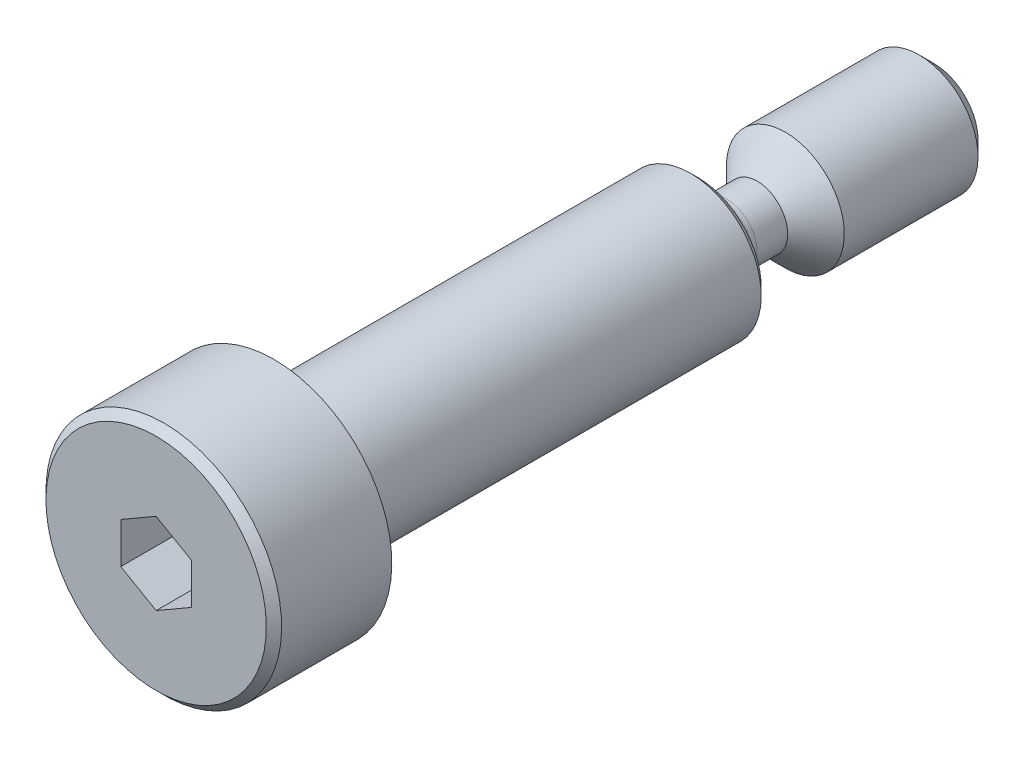
ISO-10303-21;
HEADER;
FILE_DESCRIPTION(('STEP AP214'),'2;1');
FILE_NAME('part.step','',(''),(''),'','','');
FILE_SCHEMA(('AUTOMOTIVE_DESIGN { 1 0 10303 214 1 1 1 1 }'));
ENDSEC;
DATA;
#1=APPLICATION_CONTEXT('core data for automotive mechanical design processes');
#2=APPLICATION_PROTOCOL_DEFINITION('international standard','automotive_design',2000,#1);
#3=PRODUCT_CONTEXT('',#1,'mechanical');
#4=PRODUCT('Part','Part','',(#3));
#5=PRODUCT_RELATED_PRODUCT_CATEGORY('part','',(#4));
#6=PRODUCT_DEFINITION_FORMATION('','',#4);
#7=PRODUCT_DEFINITION_CONTEXT('part definition',#1,'design');
#8=PRODUCT_DEFINITION('design','',#6,#7);
#9=PRODUCT_DEFINITION_SHAPE('','',#8);
#10=(LENGTH_UNIT() NAMED_UNIT(*) SI_UNIT(.MILLI.,.METRE.));
#11=(NAMED_UNIT(*) PLANE_ANGLE_UNIT() SI_UNIT($,.RADIAN.));
#12=(NAMED_UNIT(*) SI_UNIT($,.STERADIAN.) SOLID_ANGLE_UNIT());
#13=UNCERTAINTY_MEASURE_WITH_UNIT(LENGTH_MEASURE(1.E-05),#10,'distance_accuracy_value','');
#14=(GEOMETRIC_REPRESENTATION_CONTEXT(3) GLOBAL_UNCERTAINTY_ASSIGNED_CONTEXT((#13)) GLOBAL_UNIT_ASSIGNED_CONTEXT((#10,
#11,#12)) REPRESENTATION_CONTEXT('',''));
#15=CARTESIAN_POINT('',(0.,0.,0.));
#16=DIRECTION('',(0.,0.,1.));
#17=DIRECTION('',(1.,0.,0.));
#18=AXIS2_PLACEMENT_3D('',#15,#16,#17);
#19=CARTESIAN_POINT('',(0.,0.,-16.5));
#20=DIRECTION('',(0.,0.,-1.));
#21=DIRECTION('',(0.,1.,0.));
#22=AXIS2_PLACEMENT_3D('',#19,#20,#21);
#23=CYLINDRICAL_SURFACE('',#22,3.);
#24=CARTESIAN_POINT('',(0.,0.,-6.17499999999999));
#25=DIRECTION('',(0.,0.,-1.));
#26=DIRECTION('',(0.,1.,0.));
#27=AXIS2_PLACEMENT_3D('',#24,#25,#26);
#28=CIRCLE('',#27,3.);
#29=CARTESIAN_POINT('',(0.,3.,-6.17499999999999));
#30=VERTEX_POINT('',#29);
#31=EDGE_CURVE('E217',#30,#30,#28,.F.);
#32=ORIENTED_EDGE('',*,*,#31,.T.);
#33=EDGE_LOOP('',(#32));
#34=FACE_BOUND('',#33,.T.);
#35=CARTESIAN_POINT('',(0.,0.,10.6383333333333));
#36=DIRECTION('',(0.,0.,-1.));
#37=DIRECTION('',(0.,1.,0.));
#38=AXIS2_PLACEMENT_3D('',#35,#36,#37);
#39=CIRCLE('',#38,3.);
#40=CARTESIAN_POINT('',(0.,3.,10.6383333333333));
#41=VERTEX_POINT('',#40);
#42=EDGE_CURVE('E186',#41,#41,#39,.T.);
#43=ORIENTED_EDGE('',*,*,#42,.T.);
#44=EDGE_LOOP('',(#43));
#45=FACE_BOUND('',#44,.T.);
#46=ADVANCED_FACE('F41',(#34,#45),#23,.T.);
#47=CARTESIAN_POINT('',(0.,-3.,-6.5));
#48=DIRECTION('',(0.,0.,-1.));
#49=DIRECTION('',(0.,1.,0.));
#50=AXIS2_PLACEMENT_3D('',#47,#48,#49);
#51=PLANE('',#50);
#52=CARTESIAN_POINT('',(0.,0.,-6.5));
#53=DIRECTION('',(0.,0.,-1.));
#54=DIRECTION('',(0.,1.,0.));
#55=AXIS2_PLACEMENT_3D('',#52,#53,#54);
#56=CIRCLE('',#55,2.675);
#57=CARTESIAN_POINT('',(0.,2.67499999999999,-6.5));
#58=VERTEX_POINT('',#57);
#59=EDGE_CURVE('E213',#58,#58,#56,.T.);
#60=ORIENTED_EDGE('',*,*,#59,.T.);
#61=EDGE_LOOP('',(#60));
#62=FACE_BOUND('',#61,.T.);
#63=CARTESIAN_POINT('',(0.,0.,-6.5));
#64=DIRECTION('',(0.,0.,-1.));
#65=DIRECTION('',(0.,1.,0.));
#66=AXIS2_PLACEMENT_3D('',#63,#64,#65);
#67=CIRCLE('',#66,2.5);
#68=CARTESIAN_POINT('',(0.,2.5,-6.5));
#69=VERTEX_POINT('',#68);
#70=EDGE_CURVE('E173',#69,#69,#67,.T.);
#71=ORIENTED_EDGE('',*,*,#70,.F.);
#72=EDGE_LOOP('',(#71));
#73=FACE_BOUND('',#72,.T.);
#74=ADVANCED_FACE('F241',(#62,#73),#51,.T.);
#75=CARTESIAN_POINT('',(0.,0.,-16.5));
#76=DIRECTION('',(0.,0.,-1.));
#77=DIRECTION('',(0.,1.,0.));
#78=AXIS2_PLACEMENT_3D('',#75,#76,#77);
#79=CYLINDRICAL_SURFACE('',#78,2.33333333333333);
#80=CARTESIAN_POINT('',(0.,0.,11.0283333333333));
#81=DIRECTION('',(0.,0.,-1.));
#82=DIRECTION('',(0.,1.,0.));
#83=AXIS2_PLACEMENT_3D('',#80,#81,#82);
#84=CIRCLE('',#83,2.33333333333333);
#85=CARTESIAN_POINT('',(0.,2.33333333333333,11.0283333333333));
#86=VERTEX_POINT('',#85);
#87=EDGE_CURVE('E198',#86,#86,#84,.F.);
#88=ORIENTED_EDGE('',*,*,#87,.T.);
#89=EDGE_LOOP('',(#88));
#90=FACE_BOUND('',#89,.T.);
#91=CARTESIAN_POINT('',(0.,0.,11.5));
#92=DIRECTION('',(0.,0.,-1.));
#93=DIRECTION('',(0.,1.,0.));
#94=AXIS2_PLACEMENT_3D('',#91,#92,#93);
#95=CIRCLE('',#94,2.33333333333333);
#96=CARTESIAN_POINT('',(0.,2.33333333333333,11.5));
#97=VERTEX_POINT('',#96);
#98=EDGE_CURVE('E178',#97,#97,#95,.T.);
#99=ORIENTED_EDGE('',*,*,#98,.T.);
#100=EDGE_LOOP('',(#99));
#101=FACE_BOUND('',#100,.T.);
#102=ADVANCED_FACE('F247',(#90,#101),#79,.T.);
#103=CARTESIAN_POINT('',(0.,2.99999999999999,10.8333333333333));
#104=DIRECTION('',(0.,0.,-1.));
#105=DIRECTION('',(0.,1.,0.));
#106=AXIS2_PLACEMENT_3D('',#103,#104,#105);
#107=PLANE('',#106);
#108=CARTESIAN_POINT('',(0.,0.,10.8333333333333));
#109=DIRECTION('',(0.,0.,-1.));
#110=DIRECTION('',(0.,1.,0.));
#111=AXIS2_PLACEMENT_3D('',#108,#109,#110);
#112=CIRCLE('',#111,2.80499999999999);
#113=CARTESIAN_POINT('',(0.,2.80499999999998,10.8333333333333));
#114=VERTEX_POINT('',#113);
#115=EDGE_CURVE('E194',#114,#114,#112,.F.);
#116=ORIENTED_EDGE('',*,*,#115,.T.);
#117=EDGE_LOOP('',(#116));
#118=FACE_BOUND('',#117,.T.);
#119=CARTESIAN_POINT('',(0.,0.,10.8333333333333));
#120=DIRECTION('',(0.,0.,-1.));
#121=DIRECTION('',(0.,1.,0.));
#122=AXIS2_PLACEMENT_3D('',#119,#120,#121);
#123=CIRCLE('',#122,2.52833333333331);
#124=CARTESIAN_POINT('',(0.,2.52833333333331,10.8333333333333));
#125=VERTEX_POINT('',#124);
#126=EDGE_CURVE('E190',#125,#125,#123,.T.);
#127=ORIENTED_EDGE('',*,*,#126,.T.);
#128=EDGE_LOOP('',(#127));
#129=FACE_BOUND('',#128,.T.);
#130=ADVANCED_FACE('F263',(#118,#129),#107,.F.);
#131=CARTESIAN_POINT('',(0.,0.,16.5));
#132=DIRECTION('',(0.,0.,1.));
#133=DIRECTION('',(0.,-1.,0.));
#134=AXIS2_PLACEMENT_3D('',#131,#132,#133);
#135=PLANE('',#134);
#136=DIRECTION('',(0.,1.,0.));
#137=VECTOR('',#136,1.);
#138=CARTESIAN_POINT('',(1.5,-0.866025403784444,16.5));
#139=LINE('',#138,#137);
#140=CARTESIAN_POINT('',(1.5,-0.866025403784444,16.5));
#141=VERTEX_POINT('',#140);
#142=CARTESIAN_POINT('',(1.5,0.866025403784433,16.5));
#143=VERTEX_POINT('',#142);
#144=EDGE_CURVE('E57',#141,#143,#139,.T.);
#145=ORIENTED_EDGE('',*,*,#144,.F.);
#146=DIRECTION('',(0.866025403784439,0.5,0.));
#147=VECTOR('',#146,1.);
#148=CARTESIAN_POINT('',(0.,-1.73205080756888,16.5));
#149=LINE('',#148,#147);
#150=CARTESIAN_POINT('',(0.,-1.73205080756888,16.5));
#151=VERTEX_POINT('',#150);
#152=EDGE_CURVE('E150',#151,#141,#149,.T.);
#153=ORIENTED_EDGE('',*,*,#152,.F.);
#154=DIRECTION('',(0.866025403784439,-0.5,0.));
#155=VECTOR('',#154,1.);
#156=CARTESIAN_POINT('',(-1.5,-0.866025403784444,16.5));
#157=LINE('',#156,#155);
#158=CARTESIAN_POINT('',(-1.5,-0.866025403784444,16.5));
#159=VERTEX_POINT('',#158);
#160=EDGE_CURVE('E147',#159,#151,#157,.T.);
#161=ORIENTED_EDGE('',*,*,#160,.F.);
#162=DIRECTION('',(0.,-1.,0.));
#163=VECTOR('',#162,1.);
#164=CARTESIAN_POINT('',(-1.5,0.866025403784433,16.5));
#165=LINE('',#164,#163);
#166=CARTESIAN_POINT('',(-1.5,0.866025403784433,16.5));
#167=VERTEX_POINT('',#166);
#168=EDGE_CURVE('E105',#167,#159,#165,.T.);
#169=ORIENTED_EDGE('',*,*,#168,.F.);
#170=DIRECTION('',(-0.866025403784439,-0.5,0.));
#171=VECTOR('',#170,1.);
#172=CARTESIAN_POINT('',(0.,1.73205080756887,16.5));
#173=LINE('',#172,#171);
#174=CARTESIAN_POINT('',(0.,1.73205080756887,16.5));
#175=VERTEX_POINT('',#174);
#176=EDGE_CURVE('E141',#175,#167,#173,.T.);
#177=ORIENTED_EDGE('',*,*,#176,.F.);
#178=DIRECTION('',(-0.866025403784439,0.5,0.));
#179=VECTOR('',#178,1.);
#180=CARTESIAN_POINT('',(1.5,0.866025403784434,16.5));
#181=LINE('',#180,#179);
#182=EDGE_CURVE('E137',#143,#175,#181,.T.);
#183=ORIENTED_EDGE('',*,*,#182,.F.);
#184=EDGE_LOOP('',(#145,#153,#161,#169,#177,#183));
#185=FACE_BOUND('',#184,.T.);
#186=CARTESIAN_POINT('',(0.,0.,16.5));
#187=DIRECTION('',(0.,0.,1.));
#188=DIRECTION('',(0.,-1.,0.));
#189=AXIS2_PLACEMENT_3D('',#186,#187,#188);
#190=CIRCLE('',#189,4.67500000000001);
#191=CARTESIAN_POINT('',(0.,4.67500000000001,16.5));
#192=VERTEX_POINT('',#191);
#193=EDGE_CURVE('E11',#192,#192,#190,.T.);
#194=ORIENTED_EDGE('',*,*,#193,.T.);
#195=EDGE_LOOP('',(#194));
#196=FACE_BOUND('',#195,.T.);
#197=ADVANCED_FACE('F260',(#185,#196),#135,.T.);
#198=CARTESIAN_POINT('',(0.,0.,-16.5));
#199=DIRECTION('',(0.,0.,-1.));
#200=DIRECTION('',(0.,1.,0.));
#201=AXIS2_PLACEMENT_3D('',#198,#199,#200);
#202=CYLINDRICAL_SURFACE('',#201,5.);
#203=CARTESIAN_POINT('',(0.,0.,16.175));
#204=DIRECTION('',(0.,0.,1.));
#205=DIRECTION('',(0.,-1.,0.));
#206=AXIS2_PLACEMENT_3D('',#203,#204,#205);
#207=CIRCLE('',#206,5.);
#208=CARTESIAN_POINT('',(0.,4.99999999999999,16.175));
#209=VERTEX_POINT('',#208);
#210=EDGE_CURVE('E50',#209,#209,#207,.F.);
#211=ORIENTED_EDGE('',*,*,#210,.T.);
#212=EDGE_LOOP('',(#211));
#213=FACE_BOUND('',#212,.T.);
#214=CARTESIAN_POINT('',(0.,0.,11.5));
#215=DIRECTION('',(0.,0.,-1.));
#216=DIRECTION('',(0.,1.,0.));
#217=AXIS2_PLACEMENT_3D('',#214,#215,#216);
#218=CIRCLE('',#217,5.);
#219=CARTESIAN_POINT('',(0.,5.,11.5));
#220=VERTEX_POINT('',#219);
#221=EDGE_CURVE('E182',#220,#220,#218,.T.);
#222=ORIENTED_EDGE('',*,*,#221,.F.);
#223=EDGE_LOOP('',(#222));
#224=FACE_BOUND('',#223,.T.);
#225=ADVANCED_FACE('F224',(#213,#224),#202,.T.);
#226=CARTESIAN_POINT('',(0.,-5.,11.5));
#227=DIRECTION('',(0.,0.,-1.));
#228=DIRECTION('',(0.,1.,0.));
#229=AXIS2_PLACEMENT_3D('',#226,#227,#228);
#230=PLANE('',#229);
#231=ORIENTED_EDGE('',*,*,#221,.T.);
#232=EDGE_LOOP('',(#231));
#233=FACE_BOUND('',#232,.T.);
#234=ORIENTED_EDGE('',*,*,#98,.F.);
#235=EDGE_LOOP('',(#234));
#236=FACE_BOUND('',#235,.T.);
#237=ADVANCED_FACE('F253',(#233,#236),#230,.T.);
#238=CARTESIAN_POINT('',(0.,0.,10.6383333333333));
#239=DIRECTION('',(0.,0.,-1.));
#240=DIRECTION('',(0.,1.,0.));
#241=AXIS2_PLACEMENT_3D('',#238,#239,#240);
#242=CONICAL_SURFACE('',#241,3.,0.785398163397437);
#243=ORIENTED_EDGE('',*,*,#115,.F.);
#244=EDGE_LOOP('',(#243));
#245=FACE_BOUND('',#244,.T.);
#246=ORIENTED_EDGE('',*,*,#42,.F.);
#247=EDGE_LOOP('',(#246));
#248=FACE_BOUND('',#247,.T.);
#249=ADVANCED_FACE('F256',(#245,#248),#242,.T.);
#250=CARTESIAN_POINT('',(0.,0.,10.8333333333333));
#251=DIRECTION('',(0.,0.,-1.));
#252=DIRECTION('',(0.,1.,0.));
#253=AXIS2_PLACEMENT_3D('',#250,#251,#252);
#254=CONICAL_SURFACE('',#253,2.52833333333331,0.785398163397459);
#255=CARTESIAN_POINT('',(0.,2.33333333333333,11.0283333333333));
#256=CARTESIAN_POINT('',(0.,2.33536458333333,11.0263020833333));
#257=CARTESIAN_POINT('',(0.,2.33739583333333,11.0242708333333));
#258=CARTESIAN_POINT('',(0.,2.34145833333333,11.0202083333333));
#259=CARTESIAN_POINT('',(0.,2.34348958333333,11.0181770833333));
#260=CARTESIAN_POINT('',(0.,2.34755208333333,11.0141145833333));
#261=CARTESIAN_POINT('',(0.,2.34958333333333,11.0120833333333));
#262=CARTESIAN_POINT('',(0.,2.35364583333333,11.0080208333333));
#263=CARTESIAN_POINT('',(0.,2.35567708333333,11.0059895833333));
#264=CARTESIAN_POINT('',(0.,2.35973958333333,11.0019270833333));
#265=CARTESIAN_POINT('',(0.,2.36177083333332,10.9998958333333));
#266=CARTESIAN_POINT('',(0.,2.36583333333332,10.9958333333333));
#267=CARTESIAN_POINT('',(0.,2.36786458333332,10.9938020833333));
#268=CARTESIAN_POINT('',(0.,2.37192708333332,10.9897395833333));
#269=CARTESIAN_POINT('',(0.,2.37395833333332,10.9877083333333));
#270=CARTESIAN_POINT('',(0.,2.37802083333332,10.9836458333333));
#271=CARTESIAN_POINT('',(0.,2.38005208333332,10.9816145833333));
#272=CARTESIAN_POINT('',(0.,2.38411458333332,10.9775520833333));
#273=CARTESIAN_POINT('',(0.,2.38614583333332,10.9755208333333));
#274=CARTESIAN_POINT('',(0.,2.39020833333332,10.9714583333333));
#275=CARTESIAN_POINT('',(0.,2.39223958333332,10.9694270833333));
#276=CARTESIAN_POINT('',(0.,2.39630208333332,10.9653645833333));
#277=CARTESIAN_POINT('',(0.,2.39833333333332,10.9633333333333));
#278=CARTESIAN_POINT('',(0.,2.40239583333332,10.9592708333333));
#279=CARTESIAN_POINT('',(0.,2.40442708333332,10.9572395833333));
#280=CARTESIAN_POINT('',(0.,2.40848958333332,10.9531770833333));
#281=CARTESIAN_POINT('',(0.,2.41052083333332,10.9511458333333));
#282=CARTESIAN_POINT('',(0.,2.41458333333332,10.9470833333333));
#283=CARTESIAN_POINT('',(0.,2.41661458333332,10.9450520833333));
#284=CARTESIAN_POINT('',(0.,2.42067708333332,10.9409895833333));
#285=CARTESIAN_POINT('',(0.,2.42270833333332,10.9389583333333));
#286=CARTESIAN_POINT('',(0.,2.42677083333332,10.9348958333333));
#287=CARTESIAN_POINT('',(0.,2.42880208333332,10.9328645833333));
#288=CARTESIAN_POINT('',(0.,2.43286458333332,10.9288020833333));
#289=CARTESIAN_POINT('',(0.,2.43489583333332,10.9267708333333));
#290=CARTESIAN_POINT('',(0.,2.43895833333332,10.9227083333333));
#291=CARTESIAN_POINT('',(0.,2.44098958333332,10.9206770833333));
#292=CARTESIAN_POINT('',(0.,2.44505208333332,10.9166145833333));
#293=CARTESIAN_POINT('',(0.,2.44708333333332,10.9145833333333));
#294=CARTESIAN_POINT('',(0.,2.45114583333332,10.9105208333333));
#295=CARTESIAN_POINT('',(0.,2.45317708333332,10.9084895833333));
#296=CARTESIAN_POINT('',(0.,2.45723958333332,10.9044270833333));
#297=CARTESIAN_POINT('',(0.,2.45927083333332,10.9023958333333));
#298=CARTESIAN_POINT('',(0.,2.46333333333332,10.8983333333333));
#299=CARTESIAN_POINT('',(0.,2.46536458333331,10.8963020833333));
#300=CARTESIAN_POINT('',(0.,2.46942708333331,10.8922395833333));
#301=CARTESIAN_POINT('',(0.,2.47145833333331,10.8902083333333));
#302=CARTESIAN_POINT('',(0.,2.47552083333331,10.8861458333333));
#303=CARTESIAN_POINT('',(0.,2.47755208333331,10.8841145833333));
#304=CARTESIAN_POINT('',(0.,2.48161458333331,10.8800520833333));
#305=CARTESIAN_POINT('',(0.,2.48364583333331,10.8780208333333));
#306=CARTESIAN_POINT('',(0.,2.48770833333331,10.8739583333333));
#307=CARTESIAN_POINT('',(0.,2.48973958333331,10.8719270833333));
#308=CARTESIAN_POINT('',(0.,2.49380208333331,10.8678645833333));
#309=CARTESIAN_POINT('',(0.,2.49583333333331,10.8658333333333));
#310=CARTESIAN_POINT('',(0.,2.49989583333331,10.8617708333333));
#311=CARTESIAN_POINT('',(0.,2.50192708333331,10.8597395833333));
#312=CARTESIAN_POINT('',(0.,2.50598958333331,10.8556770833333));
#313=CARTESIAN_POINT('',(0.,2.50802083333331,10.8536458333333));
#314=CARTESIAN_POINT('',(0.,2.51208333333331,10.8495833333333));
#315=CARTESIAN_POINT('',(0.,2.51411458333331,10.8475520833333));
#316=CARTESIAN_POINT('',(0.,2.51817708333331,10.8434895833333));
#317=CARTESIAN_POINT('',(0.,2.52020833333331,10.8414583333333));
#318=CARTESIAN_POINT('',(0.,2.52427083333331,10.8373958333333));
#319=CARTESIAN_POINT('',(0.,2.52630208333331,10.8353645833333));
#320=CARTESIAN_POINT('',(0.,2.52833333333331,10.8333333333333));
#321=B_SPLINE_CURVE_WITH_KNOTS('',3,(#255,#256,#257,#258,#259,#260,#261,#262,#263,#264,#265,
#266,#267,#268,#269,#270,#271,#272,#273,#274,#275,#276,#277,#278,#279,#280,#281,#282,#283,#284,
#285,#286,#287,#288,#289,#290,#291,#292,#293,#294,#295,#296,#297,#298,#299,#300,#301,#302,#303,
#304,#305,#306,#307,#308,#309,#310,#311,#312,#313,#314,#315,#316,#317,#318,#319,#320),
.UNSPECIFIED.,.F.,.F.,(4,2,2,2,2,2,2,2,2,2,2,2,2,2,2,2,2,2,2,2,2,2,2,2,2,2,2,2,2,2,2,2,4),(0.,
0.00861786389571047,0.0172357277914212,0.0258535916871308,0.0344714555828413,0.0430893194785508,
0.0517071833742613,0.0603250472699708,0.0689429111656813,0.0775607750613921,0.0861786389571013,
0.0947965028528121,0.103414366748522,0.112032230644232,0.120650094539942,0.129267958435652,
0.137885822331362,0.146503686227072,0.155121550122783,0.163739414018492,0.172357277914203,
0.180975141809912,0.189593005705623,0.198210869601332,0.206828733497043,0.215446597392754,
0.224064461288463,0.232682325184174,0.241300189079883,0.249918052975594,0.258535916871303,
0.267153780767014,0.275771644662724),.UNSPECIFIED.);
#322=EDGE_CURVE('BSEAM267',#86,#125,#321,.T.);
#323=ORIENTED_EDGE('',*,*,#87,.F.);
#324=ORIENTED_EDGE('',*,*,#126,.F.);
#325=ORIENTED_EDGE('',*,*,#322,.T.);
#326=ORIENTED_EDGE('',*,*,#322,.F.);
#327=EDGE_LOOP('',(#323,#325,#324,#326));
#328=FACE_BOUND('',#327,.T.);
#329=ADVANCED_FACE('F267',(#328),#254,.T.);
#330=CARTESIAN_POINT('',(0.,0.,-7.70000000000001));
#331=DIRECTION('',(0.,0.,-1.));
#332=DIRECTION('',(0.,1.,0.));
#333=AXIS2_PLACEMENT_3D('',#330,#331,#332);
#334=TOROIDAL_SURFACE('',#333,2.5,1.20000000000001);
#335=CARTESIAN_POINT('',(0.,0.,-7.7));
#336=DIRECTION('',(0.,0.,-1.));
#337=DIRECTION('',(0.,1.,0.));
#338=AXIS2_PLACEMENT_3D('',#335,#336,#337);
#339=CIRCLE('',#338,1.3);
#340=CARTESIAN_POINT('',(0.,1.3,-7.7));
#341=VERTEX_POINT('',#340);
#342=EDGE_CURVE('E169',#341,#341,#339,.T.);
#343=ORIENTED_EDGE('',*,*,#342,.F.);
#344=EDGE_LOOP('',(#343));
#345=FACE_BOUND('',#344,.T.);
#346=ORIENTED_EDGE('',*,*,#70,.T.);
#347=EDGE_LOOP('',(#346));
#348=FACE_BOUND('',#347,.T.);
#349=ADVANCED_FACE('F271',(#345,#348),#334,.F.);
#350=CARTESIAN_POINT('',(0.,0.,-16.5));
#351=DIRECTION('',(0.,0.,-1.));
#352=DIRECTION('',(0.,1.,0.));
#353=AXIS2_PLACEMENT_3D('',#350,#351,#352);
#354=CYLINDRICAL_SURFACE('',#353,1.3);
#355=CARTESIAN_POINT('',(0.,0.,-9.));
#356=DIRECTION('',(0.,0.,-1.));
#357=DIRECTION('',(0.,1.,0.));
#358=AXIS2_PLACEMENT_3D('',#355,#356,#357);
#359=CIRCLE('',#358,1.3);
#360=CARTESIAN_POINT('',(0.,1.3,-9.));
#361=VERTEX_POINT('',#360);
#362=EDGE_CURVE('E156',#361,#361,#359,.T.);
#363=ORIENTED_EDGE('',*,*,#362,.F.);
#364=EDGE_LOOP('',(#363));
#365=FACE_BOUND('',#364,.T.);
#366=ORIENTED_EDGE('',*,*,#342,.T.);
#367=EDGE_LOOP('',(#366));
#368=FACE_BOUND('',#367,.T.);
#369=ADVANCED_FACE('F291',(#365,#368),#354,.T.);
#370=CARTESIAN_POINT('',(0.,0.,-9.));
#371=DIRECTION('',(0.,0.,-1.));
#372=DIRECTION('',(0.,1.,0.));
#373=AXIS2_PLACEMENT_3D('',#370,#371,#372);
#374=CONICAL_SURFACE('',#373,1.3,0.785398163397443);
#375=CARTESIAN_POINT('',(0.,0.,-10.2));
#376=DIRECTION('',(0.,0.,-1.));
#377=DIRECTION('',(0.,1.,0.));
#378=AXIS2_PLACEMENT_3D('',#375,#376,#377);
#379=CIRCLE('',#378,2.5);
#380=CARTESIAN_POINT('',(0.,2.5,-10.2));
#381=VERTEX_POINT('',#380);
#382=EDGE_CURVE('E177',#381,#381,#379,.F.);
#383=ORIENTED_EDGE('',*,*,#382,.T.);
#384=EDGE_LOOP('',(#383));
#385=FACE_BOUND('',#384,.T.);
#386=ORIENTED_EDGE('',*,*,#362,.T.);
#387=EDGE_LOOP('',(#386));
#388=FACE_BOUND('',#387,.T.);
#389=ADVANCED_FACE('F286',(#385,#388),#374,.T.);
#390=CARTESIAN_POINT('',(0.,-2.5,-16.5));
#391=DIRECTION('',(0.,0.,-1.));
#392=DIRECTION('',(0.,1.,0.));
#393=AXIS2_PLACEMENT_3D('',#390,#391,#392);
#394=PLANE('',#393);
#395=CARTESIAN_POINT('',(0.,0.,-16.5));
#396=DIRECTION('',(0.,0.,-1.));
#397=DIRECTION('',(0.,1.,0.));
#398=AXIS2_PLACEMENT_3D('',#395,#396,#397);
#399=CIRCLE('',#398,1.875);
#400=CARTESIAN_POINT('',(0.,1.875,-16.5));
#401=VERTEX_POINT('',#400);
#402=EDGE_CURVE('E202',#401,#401,#399,.T.);
#403=ORIENTED_EDGE('',*,*,#402,.T.);
#404=EDGE_LOOP('',(#403));
#405=FACE_BOUND('',#404,.T.);
#406=ADVANCED_FACE('F279',(#405),#394,.T.);
#407=CARTESIAN_POINT('',(0.,0.,-16.5));
#408=DIRECTION('',(0.,0.,-1.));
#409=DIRECTION('',(0.,1.,0.));
#410=AXIS2_PLACEMENT_3D('',#407,#408,#409);
#411=CYLINDRICAL_SURFACE('',#410,2.5);
#412=CARTESIAN_POINT('',(0.,0.,-15.875));
#413=DIRECTION('',(0.,0.,-1.));
#414=DIRECTION('',(0.,1.,0.));
#415=AXIS2_PLACEMENT_3D('',#412,#413,#414);
#416=CIRCLE('',#415,2.5);
#417=CARTESIAN_POINT('',(0.,2.5,-15.875));
#418=VERTEX_POINT('',#417);
#419=EDGE_CURVE('E209',#418,#418,#416,.F.);
#420=ORIENTED_EDGE('',*,*,#419,.T.);
#421=EDGE_LOOP('',(#420));
#422=FACE_BOUND('',#421,.T.);
#423=ORIENTED_EDGE('',*,*,#382,.F.);
#424=EDGE_LOOP('',(#423));
#425=FACE_BOUND('',#424,.T.);
#426=ADVANCED_FACE('F274',(#422,#425),#411,.T.);
#427=CARTESIAN_POINT('',(0.,0.,-16.5));
#428=DIRECTION('',(0.,0.,1.));
#429=DIRECTION('',(0.,-1.,0.));
#430=AXIS2_PLACEMENT_3D('',#427,#428,#429);
#431=CONICAL_SURFACE('',#430,1.875,0.785398163397446);
#432=ORIENTED_EDGE('',*,*,#419,.F.);
#433=EDGE_LOOP('',(#432));
#434=FACE_BOUND('',#433,.T.);
#435=ORIENTED_EDGE('',*,*,#402,.F.);
#436=EDGE_LOOP('',(#435));
#437=FACE_BOUND('',#436,.T.);
#438=ADVANCED_FACE('F237',(#434,#437),#431,.T.);
#439=CARTESIAN_POINT('',(0.,0.,-6.5));
#440=DIRECTION('',(0.,0.,1.));
#441=DIRECTION('',(0.,-1.,0.));
#442=AXIS2_PLACEMENT_3D('',#439,#440,#441);
#443=CONICAL_SURFACE('',#442,2.675,0.785398163397445);
#444=ORIENTED_EDGE('',*,*,#31,.F.);
#445=EDGE_LOOP('',(#444));
#446=FACE_BOUND('',#445,.T.);
#447=ORIENTED_EDGE('',*,*,#59,.F.);
#448=EDGE_LOOP('',(#447));
#449=FACE_BOUND('',#448,.T.);
#450=ADVANCED_FACE('F229',(#446,#449),#443,.T.);
#451=CARTESIAN_POINT('',(0.,0.,16.175));
#452=DIRECTION('',(0.,0.,-1.));
#453=DIRECTION('',(0.,1.,0.));
#454=AXIS2_PLACEMENT_3D('',#451,#452,#453);
#455=CONICAL_SURFACE('',#454,5.,0.785398163397438);
#456=CARTESIAN_POINT('',(0.,4.67500000000001,16.5));
#457=CARTESIAN_POINT('',(0.,4.67838541666667,16.4966145833333));
#458=CARTESIAN_POINT('',(0.,4.68177083333334,16.4932291666667));
#459=CARTESIAN_POINT('',(0.,4.68854166666667,16.4864583333333));
#460=CARTESIAN_POINT('',(0.,4.69192708333334,16.4830729166667));
#461=CARTESIAN_POINT('',(0.,4.69869791666667,16.4763020833333));
#462=CARTESIAN_POINT('',(0.,4.70208333333334,16.4729166666667));
#463=CARTESIAN_POINT('',(0.,4.70885416666667,16.4661458333333));
#464=CARTESIAN_POINT('',(0.,4.71223958333334,16.4627604166667));
#465=CARTESIAN_POINT('',(0.,4.71901041666667,16.4559895833333));
#466=CARTESIAN_POINT('',(0.,4.72239583333334,16.4526041666667));
#467=CARTESIAN_POINT('',(0.,4.72916666666667,16.4458333333333));
#468=CARTESIAN_POINT('',(0.,4.73255208333334,16.4424479166667));
#469=CARTESIAN_POINT('',(0.,4.73932291666667,16.4356770833333));
#470=CARTESIAN_POINT('',(0.,4.74270833333334,16.4322916666667));
#471=CARTESIAN_POINT('',(0.,4.74947916666667,16.4255208333333));
#472=CARTESIAN_POINT('',(0.,4.75286458333334,16.4221354166667));
#473=CARTESIAN_POINT('',(0.,4.75963541666667,16.4153645833333));
#474=CARTESIAN_POINT('',(0.,4.76302083333334,16.4119791666667));
#475=CARTESIAN_POINT('',(0.,4.76979166666667,16.4052083333333));
#476=CARTESIAN_POINT('',(0.,4.77317708333334,16.4018229166667));
#477=CARTESIAN_POINT('',(0.,4.77994791666667,16.3950520833333));
#478=CARTESIAN_POINT('',(0.,4.78333333333334,16.3916666666667));
#479=CARTESIAN_POINT('',(0.,4.79010416666667,16.3848958333333));
#480=CARTESIAN_POINT('',(0.,4.79348958333334,16.3815104166667));
#481=CARTESIAN_POINT('',(0.,4.80026041666667,16.3747395833333));
#482=CARTESIAN_POINT('',(0.,4.80364583333333,16.3713541666667));
#483=CARTESIAN_POINT('',(0.,4.81041666666667,16.3645833333333));
#484=CARTESIAN_POINT('',(0.,4.81380208333333,16.3611979166667));
#485=CARTESIAN_POINT('',(0.,4.82057291666667,16.3544270833333));
#486=CARTESIAN_POINT('',(0.,4.82395833333333,16.3510416666667));
#487=CARTESIAN_POINT('',(0.,4.83072916666667,16.3442708333333));
#488=CARTESIAN_POINT('',(0.,4.83411458333333,16.3408854166667));
#489=CARTESIAN_POINT('',(0.,4.84088541666667,16.3341145833333));
#490=CARTESIAN_POINT('',(0.,4.84427083333333,16.3307291666667));
#491=CARTESIAN_POINT('',(0.,4.85104166666667,16.3239583333333));
#492=CARTESIAN_POINT('',(0.,4.85442708333333,16.3205729166667));
#493=CARTESIAN_POINT('',(0.,4.86119791666667,16.3138020833333));
#494=CARTESIAN_POINT('',(0.,4.86458333333333,16.3104166666667));
#495=CARTESIAN_POINT('',(0.,4.87135416666667,16.3036458333333));
#496=CARTESIAN_POINT('',(0.,4.87473958333333,16.3002604166667));
#497=CARTESIAN_POINT('',(0.,4.88151041666667,16.2934895833333));
#498=CARTESIAN_POINT('',(0.,4.88489583333333,16.2901041666667));
#499=CARTESIAN_POINT('',(0.,4.89166666666666,16.2833333333333));
#500=CARTESIAN_POINT('',(0.,4.89505208333333,16.2799479166667));
#501=CARTESIAN_POINT('',(0.,4.90182291666666,16.2731770833333));
#502=CARTESIAN_POINT('',(0.,4.90520833333333,16.2697916666667));
#503=CARTESIAN_POINT('',(0.,4.91197916666667,16.2630208333333));
#504=CARTESIAN_POINT('',(0.,4.91536458333333,16.2596354166667));
#505=CARTESIAN_POINT('',(0.,4.92213541666666,16.2528645833333));
#506=CARTESIAN_POINT('',(0.,4.92552083333333,16.2494791666667));
#507=CARTESIAN_POINT('',(0.,4.93229166666666,16.2427083333333));
#508=CARTESIAN_POINT('',(0.,4.93567708333333,16.2393229166667));
#509=CARTESIAN_POINT('',(0.,4.94244791666666,16.2325520833333));
#510=CARTESIAN_POINT('',(0.,4.94583333333333,16.2291666666667));
#511=CARTESIAN_POINT('',(0.,4.95260416666666,16.2223958333333));
#512=CARTESIAN_POINT('',(0.,4.95598958333333,16.2190104166667));
#513=CARTESIAN_POINT('',(0.,4.96276041666666,16.2122395833333));
#514=CARTESIAN_POINT('',(0.,4.96614583333333,16.2088541666667));
#515=CARTESIAN_POINT('',(0.,4.97291666666666,16.2020833333333));
#516=CARTESIAN_POINT('',(0.,4.97630208333333,16.1986979166667));
#517=CARTESIAN_POINT('',(0.,4.98307291666666,16.1919270833333));
#518=CARTESIAN_POINT('',(0.,4.98645833333333,16.1885416666667));
#519=CARTESIAN_POINT('',(0.,4.99322916666666,16.1817708333333));
#520=CARTESIAN_POINT('',(0.,4.99661458333333,16.1783854166667));
#521=CARTESIAN_POINT('',(0.,4.99999999999999,16.175));
#522=B_SPLINE_CURVE_WITH_KNOTS('',3,(#456,#457,#458,#459,#460,#461,#462,#463,#464,#465,#466,
#467,#468,#469,#470,#471,#472,#473,#474,#475,#476,#477,#478,#479,#480,#481,#482,#483,#484,#485,
#486,#487,#488,#489,#490,#491,#492,#493,#494,#495,#496,#497,#498,#499,#500,#501,#502,#503,#504,
#505,#506,#507,#508,#509,#510,#511,#512,#513,#514,#515,#516,#517,#518,#519,#520,#521),
.UNSPECIFIED.,.F.,.F.,(4,2,2,2,2,2,2,2,2,2,2,2,2,2,2,2,2,2,2,2,2,2,2,2,2,2,2,2,2,2,2,2,4),(0.,
0.014363106492852,0.028726212985704,0.043089319478556,0.0574524259714074,0.071815532464257,
0.086178638957109,0.100541745449961,0.114904851942813,0.129267958435665,0.143631064928515,
0.157994171421367,0.172357277914218,0.18672038440707,0.20108349089992,0.215446597392771,
0.229809703885624,0.244172810378475,0.258535916871327,0.272899023364177,0.287262129857028,
0.30162523634988,0.315988342842733,0.330351449335582,0.344714555828434,0.359077662321286,
0.373440768814138,0.38780387530699,0.40216698179984,0.416530088292691,0.430893194785543,
0.445256301278395,0.459619407771247),.UNSPECIFIED.);
#523=EDGE_CURVE('BSEAM43',#192,#209,#522,.T.);
#524=ORIENTED_EDGE('',*,*,#193,.F.);
#525=ORIENTED_EDGE('',*,*,#210,.F.);
#526=ORIENTED_EDGE('',*,*,#523,.T.);
#527=ORIENTED_EDGE('',*,*,#523,.F.);
#528=EDGE_LOOP('',(#524,#526,#525,#527));
#529=FACE_BOUND('',#528,.T.);
#530=ADVANCED_FACE('F43',(#529),#455,.T.);
#531=CARTESIAN_POINT('',(1.5,-0.866025403784444,14.));
#532=DIRECTION('',(1.,0.,0.));
#533=DIRECTION('',(0.,1.,0.));
#534=AXIS2_PLACEMENT_3D('',#531,#532,#533);
#535=PLANE('',#534);
#536=ORIENTED_EDGE('',*,*,#144,.T.);
#537=DIRECTION('',(0.,0.,1.));
#538=VECTOR('',#537,1.);
#539=CARTESIAN_POINT('',(1.5,0.866025403784434,14.));
#540=LINE('',#539,#538);
#541=CARTESIAN_POINT('',(1.5,0.866025403784434,14.));
#542=VERTEX_POINT('',#541);
#543=EDGE_CURVE('E87',#542,#143,#540,.T.);
#544=ORIENTED_EDGE('',*,*,#543,.F.);
#545=DIRECTION('',(0.,1.,0.));
#546=VECTOR('',#545,1.);
#547=CARTESIAN_POINT('',(1.5,-0.866025403784444,14.));
#548=LINE('',#547,#546);
#549=CARTESIAN_POINT('',(1.5,-0.866025403784444,14.));
#550=VERTEX_POINT('',#549);
#551=EDGE_CURVE('E153',#550,#542,#548,.T.);
#552=ORIENTED_EDGE('',*,*,#551,.F.);
#553=DIRECTION('',(0.,0.,1.));
#554=VECTOR('',#553,1.);
#555=CARTESIAN_POINT('',(1.5,-0.866025403784444,14.));
#556=LINE('',#555,#554);
#557=EDGE_CURVE('E65',#550,#141,#556,.T.);
#558=ORIENTED_EDGE('',*,*,#557,.T.);
#559=EDGE_LOOP('',(#536,#544,#552,#558));
#560=FACE_BOUND('',#559,.T.);
#561=ADVANCED_FACE('F228',(#560),#535,.F.);
#562=CARTESIAN_POINT('',(0.,-1.73205080756888,14.));
#563=DIRECTION('',(0.5,-0.866025403784439,0.));
#564=DIRECTION('',(0.866025403784439,0.5,0.));
#565=AXIS2_PLACEMENT_3D('',#562,#563,#564);
#566=PLANE('',#565);
#567=ORIENTED_EDGE('',*,*,#152,.T.);
#568=ORIENTED_EDGE('',*,*,#557,.F.);
#569=DIRECTION('',(0.866025403784439,0.5,0.));
#570=VECTOR('',#569,1.);
#571=CARTESIAN_POINT('',(0.,-1.73205080756888,14.));
#572=LINE('',#571,#570);
#573=CARTESIAN_POINT('',(0.,-1.73205080756888,14.));
#574=VERTEX_POINT('',#573);
#575=EDGE_CURVE('E119',#574,#550,#572,.T.);
#576=ORIENTED_EDGE('',*,*,#575,.F.);
#577=DIRECTION('',(0.,0.,1.));
#578=VECTOR('',#577,1.);
#579=CARTESIAN_POINT('',(0.,-1.73205080756888,14.));
#580=LINE('',#579,#578);
#581=EDGE_CURVE('E110',#574,#151,#580,.T.);
#582=ORIENTED_EDGE('',*,*,#581,.T.);
#583=EDGE_LOOP('',(#567,#568,#576,#582));
#584=FACE_BOUND('',#583,.T.);
#585=ADVANCED_FACE('F235',(#584),#566,.F.);
#586=CARTESIAN_POINT('',(-1.5,-0.866025403784444,14.));
#587=DIRECTION('',(-0.5,-0.866025403784438,0.));
#588=DIRECTION('',(0.866025403784439,-0.5,0.));
#589=AXIS2_PLACEMENT_3D('',#586,#587,#588);
#590=PLANE('',#589);
#591=ORIENTED_EDGE('',*,*,#160,.T.);
#592=ORIENTED_EDGE('',*,*,#581,.F.);
#593=DIRECTION('',(0.866025403784439,-0.5,0.));
#594=VECTOR('',#593,1.);
#595=CARTESIAN_POINT('',(-1.5,-0.866025403784444,14.));
#596=LINE('',#595,#594);
#597=CARTESIAN_POINT('',(-1.5,-0.866025403784444,14.));
#598=VERTEX_POINT('',#597);
#599=EDGE_CURVE('E114',#598,#574,#596,.T.);
#600=ORIENTED_EDGE('',*,*,#599,.F.);
#601=DIRECTION('',(0.,0.,1.));
#602=VECTOR('',#601,1.);
#603=CARTESIAN_POINT('',(-1.5,-0.866025403784444,14.));
#604=LINE('',#603,#602);
#605=EDGE_CURVE('E98',#598,#159,#604,.T.);
#606=ORIENTED_EDGE('',*,*,#605,.T.);
#607=EDGE_LOOP('',(#591,#592,#600,#606));
#608=FACE_BOUND('',#607,.T.);
#609=ADVANCED_FACE('F115',(#608),#590,.F.);
#610=CARTESIAN_POINT('',(-1.5,0.866025403784433,14.));
#611=DIRECTION('',(-1.,0.,0.));
#612=DIRECTION('',(0.,0.,1.));
#613=AXIS2_PLACEMENT_3D('',#610,#611,#612);
#614=PLANE('',#613);
#615=ORIENTED_EDGE('',*,*,#168,.T.);
#616=ORIENTED_EDGE('',*,*,#605,.F.);
#617=DIRECTION('',(0.,-1.,0.));
#618=VECTOR('',#617,1.);
#619=CARTESIAN_POINT('',(-1.5,0.866025403784433,14.));
#620=LINE('',#619,#618);
#621=CARTESIAN_POINT('',(-1.5,0.866025403784433,14.));
#622=VERTEX_POINT('',#621);
#623=EDGE_CURVE('E102',#622,#598,#620,.T.);
#624=ORIENTED_EDGE('',*,*,#623,.F.);
#625=DIRECTION('',(0.,0.,1.));
#626=VECTOR('',#625,1.);
#627=CARTESIAN_POINT('',(-1.5,0.866025403784433,14.));
#628=LINE('',#627,#626);
#629=EDGE_CURVE('E111',#622,#167,#628,.T.);
#630=ORIENTED_EDGE('',*,*,#629,.T.);
#631=EDGE_LOOP('',(#615,#616,#624,#630));
#632=FACE_BOUND('',#631,.T.);
#633=ADVANCED_FACE('F100',(#632),#614,.F.);
#634=CARTESIAN_POINT('',(0.,1.73205080756887,14.));
#635=DIRECTION('',(-0.5,0.866025403784439,0.));
#636=DIRECTION('',(-0.866025403784439,-0.5,0.));
#637=AXIS2_PLACEMENT_3D('',#634,#635,#636);
#638=PLANE('',#637);
#639=ORIENTED_EDGE('',*,*,#176,.T.);
#640=ORIENTED_EDGE('',*,*,#629,.F.);
#641=DIRECTION('',(-0.866025403784439,-0.5,0.));
#642=VECTOR('',#641,1.);
#643=CARTESIAN_POINT('',(0.,1.73205080756887,14.));
#644=LINE('',#643,#642);
#645=CARTESIAN_POINT('',(0.,1.73205080756887,14.));
#646=VERTEX_POINT('',#645);
#647=EDGE_CURVE('E125',#646,#622,#644,.T.);
#648=ORIENTED_EDGE('',*,*,#647,.F.);
#649=DIRECTION('',(0.,0.,1.));
#650=VECTOR('',#649,1.);
#651=CARTESIAN_POINT('',(0.,1.73205080756887,14.));
#652=LINE('',#651,#650);
#653=EDGE_CURVE('E161',#646,#175,#652,.T.);
#654=ORIENTED_EDGE('',*,*,#653,.T.);
#655=EDGE_LOOP('',(#639,#640,#648,#654));
#656=FACE_BOUND('',#655,.T.);
#657=ADVANCED_FACE('F310',(#656),#638,.F.);
#658=CARTESIAN_POINT('',(1.5,0.866025403784434,14.));
#659=DIRECTION('',(0.5,0.866025403784439,0.));
#660=DIRECTION('',(-0.866025403784439,0.5,0.));
#661=AXIS2_PLACEMENT_3D('',#658,#659,#660);
#662=PLANE('',#661);
#663=ORIENTED_EDGE('',*,*,#182,.T.);
#664=ORIENTED_EDGE('',*,*,#653,.F.);
#665=DIRECTION('',(-0.866025403784439,0.5,0.));
#666=VECTOR('',#665,1.);
#667=CARTESIAN_POINT('',(1.5,0.866025403784434,14.));
#668=LINE('',#667,#666);
#669=EDGE_CURVE('E129',#542,#646,#668,.T.);
#670=ORIENTED_EDGE('',*,*,#669,.F.);
#671=ORIENTED_EDGE('',*,*,#543,.T.);
#672=EDGE_LOOP('',(#663,#664,#670,#671));
#673=FACE_BOUND('',#672,.T.);
#674=ADVANCED_FACE('F307',(#673),#662,.F.);
#675=CARTESIAN_POINT('',(0.,0.,14.));
#676=DIRECTION('',(0.,0.,1.));
#677=DIRECTION('',(1.,0.,0.));
#678=AXIS2_PLACEMENT_3D('',#675,#676,#677);
#679=PLANE('',#678);
#680=ORIENTED_EDGE('',*,*,#551,.T.);
#681=ORIENTED_EDGE('',*,*,#669,.T.);
#682=ORIENTED_EDGE('',*,*,#647,.T.);
#683=ORIENTED_EDGE('',*,*,#623,.T.);
#684=ORIENTED_EDGE('',*,*,#599,.T.);
#685=ORIENTED_EDGE('',*,*,#575,.T.);
#686=EDGE_LOOP('',(#680,#681,#682,#683,#684,#685));
#687=FACE_BOUND('',#686,.T.);
#688=ADVANCED_FACE('F122',(#687),#679,.T.);
#689=CLOSED_SHELL('',(#46,#74,#102,#130,#197,#225,#237,#249,#329,#349,#369,#389,#406,#426,#438,
#450,#530,#561,#585,#609,#633,#657,#674,#688));
#690=MANIFOLD_SOLID_BREP('B2',#689);
#691=ADVANCED_BREP_SHAPE_REPRESENTATION('',(#18,#690),#14);
#692=SHAPE_DEFINITION_REPRESENTATION(#9,#691);
ENDSEC;
END-ISO-10303-21;
